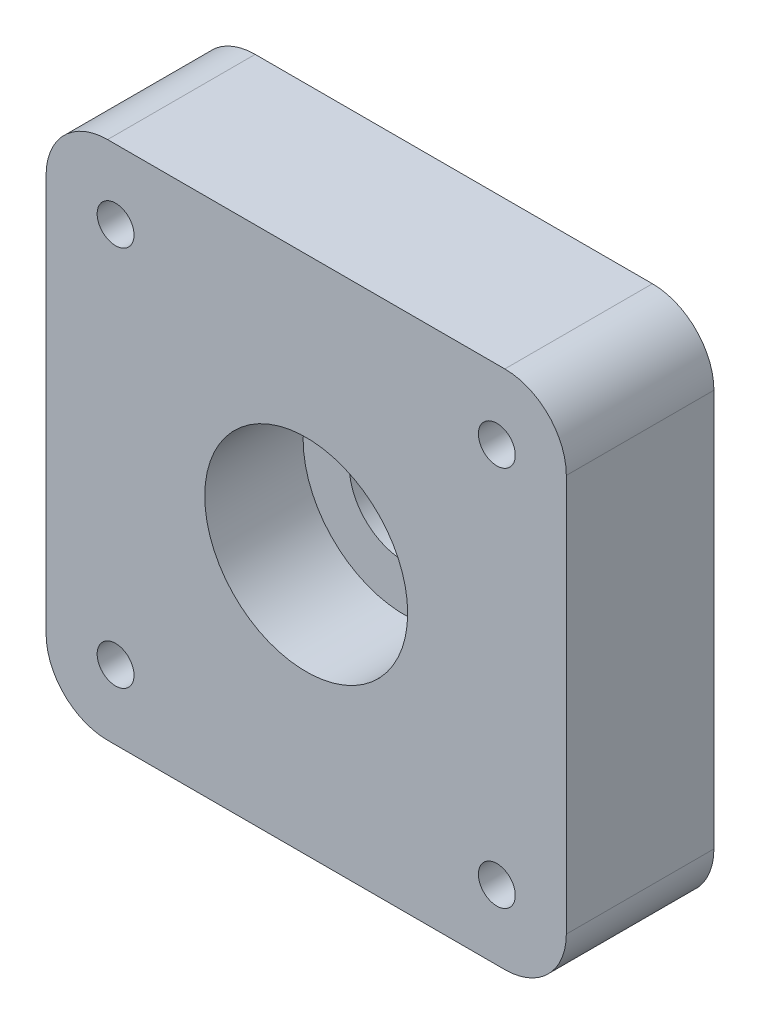
ISO-10303-21;
HEADER;
FILE_DESCRIPTION(('STEP AP214'),'2;1');
FILE_NAME('part.step','',(''),(''),'','','');
FILE_SCHEMA(('AUTOMOTIVE_DESIGN { 1 0 10303 214 1 1 1 1 }'));
ENDSEC;
DATA;
#1=APPLICATION_CONTEXT('core data for automotive mechanical design processes');
#2=APPLICATION_PROTOCOL_DEFINITION('international standard','automotive_design',2000,#1);
#3=PRODUCT_CONTEXT('',#1,'mechanical');
#4=PRODUCT('Part','Part','',(#3));
#5=PRODUCT_RELATED_PRODUCT_CATEGORY('part','',(#4));
#6=PRODUCT_DEFINITION_FORMATION('','',#4);
#7=PRODUCT_DEFINITION_CONTEXT('part definition',#1,'design');
#8=PRODUCT_DEFINITION('design','',#6,#7);
#9=PRODUCT_DEFINITION_SHAPE('','',#8);
#10=(LENGTH_UNIT() NAMED_UNIT(*) SI_UNIT(.MILLI.,.METRE.));
#11=(NAMED_UNIT(*) PLANE_ANGLE_UNIT() SI_UNIT($,.RADIAN.));
#12=(NAMED_UNIT(*) SI_UNIT($,.STERADIAN.) SOLID_ANGLE_UNIT());
#13=UNCERTAINTY_MEASURE_WITH_UNIT(LENGTH_MEASURE(1.E-05),#10,'distance_accuracy_value','');
#14=(GEOMETRIC_REPRESENTATION_CONTEXT(3) GLOBAL_UNCERTAINTY_ASSIGNED_CONTEXT((#13)) GLOBAL_UNIT_ASSIGNED_CONTEXT((#10,
#11,#12)) REPRESENTATION_CONTEXT('',''));
#15=CARTESIAN_POINT('',(0.,0.,0.));
#16=DIRECTION('',(0.,0.,1.));
#17=DIRECTION('',(1.,0.,0.));
#18=AXIS2_PLACEMENT_3D('',#15,#16,#17);
#19=CARTESIAN_POINT('',(0.,0.,6.));
#20=DIRECTION('',(0.,0.,-1.));
#21=DIRECTION('',(-1.,0.,0.));
#22=AXIS2_PLACEMENT_3D('',#19,#20,#21);
#23=PLANE('',#22);
#24=CARTESIAN_POINT('',(0.,0.,6.));
#25=DIRECTION('',(0.,0.,1.));
#26=DIRECTION('',(1.,0.,0.));
#27=AXIS2_PLACEMENT_3D('',#24,#25,#26);
#28=CIRCLE('',#27,8.25);
#29=CARTESIAN_POINT('',(8.25,0.,6.));
#30=VERTEX_POINT('',#29);
#31=EDGE_CURVE('E242',#30,#30,#28,.T.);
#32=ORIENTED_EDGE('',*,*,#31,.F.);
#33=EDGE_LOOP('',(#32));
#34=FACE_BOUND('',#33,.T.);
#35=DIRECTION('',(-1.,0.,0.));
#36=VECTOR('',#35,1.);
#37=CARTESIAN_POINT('',(-21.15,21.15,6.));
#38=LINE('',#37,#36);
#39=CARTESIAN_POINT('',(16.15,21.15,6.));
#40=VERTEX_POINT('',#39);
#41=CARTESIAN_POINT('',(-16.15,21.15,6.));
#42=VERTEX_POINT('',#41);
#43=EDGE_CURVE('E196',#40,#42,#38,.T.);
#44=ORIENTED_EDGE('',*,*,#43,.T.);
#45=CARTESIAN_POINT('',(-16.15,16.15,6.));
#46=DIRECTION('',(0.,0.,-1.));
#47=DIRECTION('',(-1.,0.,0.));
#48=AXIS2_PLACEMENT_3D('',#45,#46,#47);
#49=CIRCLE('',#48,5.);
#50=CARTESIAN_POINT('',(-21.15,16.15,6.));
#51=VERTEX_POINT('',#50);
#52=EDGE_CURVE('E171',#42,#51,#49,.F.);
#53=ORIENTED_EDGE('',*,*,#52,.T.);
#54=DIRECTION('',(0.,-1.,0.));
#55=VECTOR('',#54,1.);
#56=CARTESIAN_POINT('',(-21.15,-21.15,6.));
#57=LINE('',#56,#55);
#58=CARTESIAN_POINT('',(-21.15,-16.15,6.));
#59=VERTEX_POINT('',#58);
#60=EDGE_CURVE('E128',#51,#59,#57,.T.);
#61=ORIENTED_EDGE('',*,*,#60,.T.);
#62=CARTESIAN_POINT('',(-16.15,-16.15,6.));
#63=DIRECTION('',(0.,0.,-1.));
#64=DIRECTION('',(-1.,0.,0.));
#65=AXIS2_PLACEMENT_3D('',#62,#63,#64);
#66=CIRCLE('',#65,5.);
#67=CARTESIAN_POINT('',(-16.15,-21.15,6.));
#68=VERTEX_POINT('',#67);
#69=EDGE_CURVE('E63',#59,#68,#66,.F.);
#70=ORIENTED_EDGE('',*,*,#69,.T.);
#71=DIRECTION('',(1.,0.,0.));
#72=VECTOR('',#71,1.);
#73=CARTESIAN_POINT('',(-21.15,-21.15,6.));
#74=LINE('',#73,#72);
#75=CARTESIAN_POINT('',(16.15,-21.15,6.));
#76=VERTEX_POINT('',#75);
#77=EDGE_CURVE('E149',#68,#76,#74,.T.);
#78=ORIENTED_EDGE('',*,*,#77,.T.);
#79=CARTESIAN_POINT('',(16.15,-16.15,6.));
#80=DIRECTION('',(0.,0.,-1.));
#81=DIRECTION('',(-1.,0.,0.));
#82=AXIS2_PLACEMENT_3D('',#79,#80,#81);
#83=CIRCLE('',#82,5.);
#84=CARTESIAN_POINT('',(21.15,-16.15,6.));
#85=VERTEX_POINT('',#84);
#86=EDGE_CURVE('E166',#76,#85,#83,.F.);
#87=ORIENTED_EDGE('',*,*,#86,.T.);
#88=DIRECTION('',(0.,1.,0.));
#89=VECTOR('',#88,1.);
#90=CARTESIAN_POINT('',(21.15,-21.15,6.));
#91=LINE('',#90,#89);
#92=CARTESIAN_POINT('',(21.15,16.15,6.));
#93=VERTEX_POINT('',#92);
#94=EDGE_CURVE('E142',#85,#93,#91,.T.);
#95=ORIENTED_EDGE('',*,*,#94,.T.);
#96=CARTESIAN_POINT('',(16.15,16.15,6.));
#97=DIRECTION('',(0.,0.,-1.));
#98=DIRECTION('',(-1.,0.,0.));
#99=AXIS2_PLACEMENT_3D('',#96,#97,#98);
#100=CIRCLE('',#99,5.);
#101=EDGE_CURVE('E163',#93,#40,#100,.F.);
#102=ORIENTED_EDGE('',*,*,#101,.T.);
#103=EDGE_LOOP('',(#44,#53,#61,#70,#78,#87,#95,#102));
#104=FACE_BOUND('',#103,.T.);
#105=CARTESIAN_POINT('',(-15.5,15.5,6.));
#106=DIRECTION('',(0.,0.,1.));
#107=DIRECTION('',(1.,0.,0.));
#108=AXIS2_PLACEMENT_3D('',#105,#106,#107);
#109=CIRCLE('',#108,1.5);
#110=CARTESIAN_POINT('',(-14.,15.5,6.));
#111=VERTEX_POINT('',#110);
#112=EDGE_CURVE('E202',#111,#111,#109,.T.);
#113=ORIENTED_EDGE('',*,*,#112,.F.);
#114=EDGE_LOOP('',(#113));
#115=FACE_BOUND('',#114,.T.);
#116=CARTESIAN_POINT('',(-15.5,-15.5,6.));
#117=DIRECTION('',(0.,0.,1.));
#118=DIRECTION('',(1.,0.,0.));
#119=AXIS2_PLACEMENT_3D('',#116,#117,#118);
#120=CIRCLE('',#119,1.5);
#121=CARTESIAN_POINT('',(-14.,-15.5,6.));
#122=VERTEX_POINT('',#121);
#123=EDGE_CURVE('E216',#122,#122,#120,.T.);
#124=ORIENTED_EDGE('',*,*,#123,.F.);
#125=EDGE_LOOP('',(#124));
#126=FACE_BOUND('',#125,.T.);
#127=CARTESIAN_POINT('',(15.5,-15.5,6.));
#128=DIRECTION('',(0.,0.,1.));
#129=DIRECTION('',(-1.,0.,0.));
#130=AXIS2_PLACEMENT_3D('',#127,#128,#129);
#131=CIRCLE('',#130,1.5);
#132=CARTESIAN_POINT('',(14.,-15.5,6.));
#133=VERTEX_POINT('',#132);
#134=EDGE_CURVE('E222',#133,#133,#131,.T.);
#135=ORIENTED_EDGE('',*,*,#134,.F.);
#136=EDGE_LOOP('',(#135));
#137=FACE_BOUND('',#136,.T.);
#138=CARTESIAN_POINT('',(15.5,15.5,6.));
#139=DIRECTION('',(0.,0.,1.));
#140=DIRECTION('',(-1.,0.,0.));
#141=AXIS2_PLACEMENT_3D('',#138,#139,#140);
#142=CIRCLE('',#141,1.5);
#143=CARTESIAN_POINT('',(14.,15.5,6.));
#144=VERTEX_POINT('',#143);
#145=EDGE_CURVE('E230',#144,#144,#142,.T.);
#146=ORIENTED_EDGE('',*,*,#145,.F.);
#147=EDGE_LOOP('',(#146));
#148=FACE_BOUND('',#147,.T.);
#149=ADVANCED_FACE('F39',(#34,#104,#115,#126,#137,#148),#23,.F.);
#150=CARTESIAN_POINT('',(0.,0.,-6.));
#151=DIRECTION('',(0.,0.,-1.));
#152=DIRECTION('',(-1.,0.,0.));
#153=AXIS2_PLACEMENT_3D('',#150,#151,#152);
#154=PLANE('',#153);
#155=CARTESIAN_POINT('',(0.,0.,-6.));
#156=DIRECTION('',(0.,0.,-1.));
#157=DIRECTION('',(-1.,0.,0.));
#158=AXIS2_PLACEMENT_3D('',#155,#156,#157);
#159=CIRCLE('',#158,4.5);
#160=CARTESIAN_POINT('',(-4.5,0.,-6.));
#161=VERTEX_POINT('',#160);
#162=EDGE_CURVE('E249',#161,#161,#159,.T.);
#163=ORIENTED_EDGE('',*,*,#162,.F.);
#164=EDGE_LOOP('',(#163));
#165=FACE_BOUND('',#164,.T.);
#166=CARTESIAN_POINT('',(15.5,-15.5,-6.));
#167=DIRECTION('',(0.,0.,1.));
#168=DIRECTION('',(-1.,0.,0.));
#169=AXIS2_PLACEMENT_3D('',#166,#167,#168);
#170=CIRCLE('',#169,1.5);
#171=CARTESIAN_POINT('',(14.,-15.5,-6.));
#172=VERTEX_POINT('',#171);
#173=EDGE_CURVE('E226',#172,#172,#170,.T.);
#174=ORIENTED_EDGE('',*,*,#173,.T.);
#175=EDGE_LOOP('',(#174));
#176=FACE_BOUND('',#175,.T.);
#177=CARTESIAN_POINT('',(-15.5,15.5,-6.));
#178=DIRECTION('',(0.,0.,1.));
#179=DIRECTION('',(1.,0.,0.));
#180=AXIS2_PLACEMENT_3D('',#177,#178,#179);
#181=CIRCLE('',#180,1.5);
#182=CARTESIAN_POINT('',(-14.,15.5,-6.));
#183=VERTEX_POINT('',#182);
#184=EDGE_CURVE('E205',#183,#183,#181,.T.);
#185=ORIENTED_EDGE('',*,*,#184,.T.);
#186=EDGE_LOOP('',(#185));
#187=FACE_BOUND('',#186,.T.);
#188=DIRECTION('',(0.,-1.,0.));
#189=VECTOR('',#188,1.);
#190=CARTESIAN_POINT('',(-21.15,-21.15,-6.));
#191=LINE('',#190,#189);
#192=CARTESIAN_POINT('',(-21.15,16.15,-6.));
#193=VERTEX_POINT('',#192);
#194=CARTESIAN_POINT('',(-21.15,-16.15,-6.));
#195=VERTEX_POINT('',#194);
#196=EDGE_CURVE('E126',#193,#195,#191,.T.);
#197=ORIENTED_EDGE('',*,*,#196,.F.);
#198=CARTESIAN_POINT('',(-16.15,16.15,-6.));
#199=DIRECTION('',(0.,0.,-1.));
#200=DIRECTION('',(-1.,0.,0.));
#201=AXIS2_PLACEMENT_3D('',#198,#199,#200);
#202=CIRCLE('',#201,5.);
#203=CARTESIAN_POINT('',(-16.15,21.15,-6.));
#204=VERTEX_POINT('',#203);
#205=EDGE_CURVE('E108',#193,#204,#202,.T.);
#206=ORIENTED_EDGE('',*,*,#205,.T.);
#207=DIRECTION('',(-1.,0.,0.));
#208=VECTOR('',#207,1.);
#209=CARTESIAN_POINT('',(-21.15,21.15,-6.));
#210=LINE('',#209,#208);
#211=CARTESIAN_POINT('',(16.15,21.15,-6.));
#212=VERTEX_POINT('',#211);
#213=EDGE_CURVE('E138',#212,#204,#210,.T.);
#214=ORIENTED_EDGE('',*,*,#213,.F.);
#215=CARTESIAN_POINT('',(16.15,16.15,-6.));
#216=DIRECTION('',(0.,0.,-1.));
#217=DIRECTION('',(-1.,0.,0.));
#218=AXIS2_PLACEMENT_3D('',#215,#216,#217);
#219=CIRCLE('',#218,5.);
#220=CARTESIAN_POINT('',(21.15,16.15,-6.));
#221=VERTEX_POINT('',#220);
#222=EDGE_CURVE('E130',#212,#221,#219,.T.);
#223=ORIENTED_EDGE('',*,*,#222,.T.);
#224=DIRECTION('',(0.,1.,0.));
#225=VECTOR('',#224,1.);
#226=CARTESIAN_POINT('',(21.15,-21.15,-6.));
#227=LINE('',#226,#225);
#228=CARTESIAN_POINT('',(21.15,-16.15,-6.));
#229=VERTEX_POINT('',#228);
#230=EDGE_CURVE('E144',#229,#221,#227,.T.);
#231=ORIENTED_EDGE('',*,*,#230,.F.);
#232=CARTESIAN_POINT('',(16.15,-16.15,-6.));
#233=DIRECTION('',(0.,0.,-1.));
#234=DIRECTION('',(-1.,0.,0.));
#235=AXIS2_PLACEMENT_3D('',#232,#233,#234);
#236=CIRCLE('',#235,5.);
#237=CARTESIAN_POINT('',(16.15,-21.15,-6.));
#238=VERTEX_POINT('',#237);
#239=EDGE_CURVE('E153',#229,#238,#236,.T.);
#240=ORIENTED_EDGE('',*,*,#239,.T.);
#241=DIRECTION('',(1.,0.,0.));
#242=VECTOR('',#241,1.);
#243=CARTESIAN_POINT('',(-21.15,-21.15,-6.));
#244=LINE('',#243,#242);
#245=CARTESIAN_POINT('',(-16.15,-21.15,-6.));
#246=VERTEX_POINT('',#245);
#247=EDGE_CURVE('E137',#246,#238,#244,.T.);
#248=ORIENTED_EDGE('',*,*,#247,.F.);
#249=CARTESIAN_POINT('',(-16.15,-16.15,-6.));
#250=DIRECTION('',(0.,0.,-1.));
#251=DIRECTION('',(-1.,0.,0.));
#252=AXIS2_PLACEMENT_3D('',#249,#250,#251);
#253=CIRCLE('',#252,5.);
#254=EDGE_CURVE('E120',#246,#195,#253,.T.);
#255=ORIENTED_EDGE('',*,*,#254,.T.);
#256=EDGE_LOOP('',(#197,#206,#214,#223,#231,#240,#248,#255));
#257=FACE_BOUND('',#256,.T.);
#258=CARTESIAN_POINT('',(-15.5,-15.5,-6.));
#259=DIRECTION('',(0.,0.,1.));
#260=DIRECTION('',(1.,0.,0.));
#261=AXIS2_PLACEMENT_3D('',#258,#259,#260);
#262=CIRCLE('',#261,1.5);
#263=CARTESIAN_POINT('',(-14.,-15.5,-6.));
#264=VERTEX_POINT('',#263);
#265=EDGE_CURVE('E218',#264,#264,#262,.T.);
#266=ORIENTED_EDGE('',*,*,#265,.T.);
#267=EDGE_LOOP('',(#266));
#268=FACE_BOUND('',#267,.T.);
#269=CARTESIAN_POINT('',(15.5,15.5,-6.));
#270=DIRECTION('',(0.,0.,1.));
#271=DIRECTION('',(-1.,0.,0.));
#272=AXIS2_PLACEMENT_3D('',#269,#270,#271);
#273=CIRCLE('',#272,1.5);
#274=CARTESIAN_POINT('',(14.,15.5,-6.));
#275=VERTEX_POINT('',#274);
#276=EDGE_CURVE('E234',#275,#275,#273,.T.);
#277=ORIENTED_EDGE('',*,*,#276,.T.);
#278=EDGE_LOOP('',(#277));
#279=FACE_BOUND('',#278,.T.);
#280=ADVANCED_FACE('F133',(#165,#176,#187,#257,#268,#279),#154,.T.);
#281=CARTESIAN_POINT('',(21.15,-21.15,6.));
#282=DIRECTION('',(-1.,0.,0.));
#283=DIRECTION('',(0.,0.,1.));
#284=AXIS2_PLACEMENT_3D('',#281,#282,#283);
#285=PLANE('',#284);
#286=ORIENTED_EDGE('',*,*,#94,.F.);
#287=DIRECTION('',(0.,0.,-1.));
#288=VECTOR('',#287,1.);
#289=CARTESIAN_POINT('',(21.15,-16.15,6.));
#290=LINE('',#289,#288);
#291=EDGE_CURVE('E11',#85,#229,#290,.T.);
#292=ORIENTED_EDGE('',*,*,#291,.T.);
#293=ORIENTED_EDGE('',*,*,#230,.T.);
#294=DIRECTION('',(0.,0.,-1.));
#295=VECTOR('',#294,1.);
#296=CARTESIAN_POINT('',(21.15,16.15,6.));
#297=LINE('',#296,#295);
#298=EDGE_CURVE('E49',#221,#93,#297,.F.);
#299=ORIENTED_EDGE('',*,*,#298,.T.);
#300=EDGE_LOOP('',(#286,#292,#293,#299));
#301=FACE_BOUND('',#300,.T.);
#302=ADVANCED_FACE('F186',(#301),#285,.F.);
#303=CARTESIAN_POINT('',(-21.15,21.15,6.));
#304=DIRECTION('',(0.,-1.,0.));
#305=DIRECTION('',(0.,0.,-1.));
#306=AXIS2_PLACEMENT_3D('',#303,#304,#305);
#307=PLANE('',#306);
#308=ORIENTED_EDGE('',*,*,#213,.T.);
#309=DIRECTION('',(0.,0.,-1.));
#310=VECTOR('',#309,1.);
#311=CARTESIAN_POINT('',(-16.15,21.15,6.));
#312=LINE('',#311,#310);
#313=EDGE_CURVE('E113',#204,#42,#312,.F.);
#314=ORIENTED_EDGE('',*,*,#313,.T.);
#315=ORIENTED_EDGE('',*,*,#43,.F.);
#316=DIRECTION('',(0.,0.,-1.));
#317=VECTOR('',#316,1.);
#318=CARTESIAN_POINT('',(16.15,21.15,6.));
#319=LINE('',#318,#317);
#320=EDGE_CURVE('E119',#40,#212,#319,.T.);
#321=ORIENTED_EDGE('',*,*,#320,.T.);
#322=EDGE_LOOP('',(#308,#314,#315,#321));
#323=FACE_BOUND('',#322,.T.);
#324=ADVANCED_FACE('F200',(#323),#307,.F.);
#325=CARTESIAN_POINT('',(-21.15,-21.15,6.));
#326=DIRECTION('',(1.,0.,0.));
#327=DIRECTION('',(0.,0.,-1.));
#328=AXIS2_PLACEMENT_3D('',#325,#326,#327);
#329=PLANE('',#328);
#330=ORIENTED_EDGE('',*,*,#60,.F.);
#331=DIRECTION('',(0.,0.,-1.));
#332=VECTOR('',#331,1.);
#333=CARTESIAN_POINT('',(-21.15,16.15,6.));
#334=LINE('',#333,#332);
#335=EDGE_CURVE('E112',#51,#193,#334,.T.);
#336=ORIENTED_EDGE('',*,*,#335,.T.);
#337=ORIENTED_EDGE('',*,*,#196,.T.);
#338=DIRECTION('',(0.,0.,-1.));
#339=VECTOR('',#338,1.);
#340=CARTESIAN_POINT('',(-21.15,-16.15,6.));
#341=LINE('',#340,#339);
#342=EDGE_CURVE('E131',#195,#59,#341,.F.);
#343=ORIENTED_EDGE('',*,*,#342,.T.);
#344=EDGE_LOOP('',(#330,#336,#337,#343));
#345=FACE_BOUND('',#344,.T.);
#346=ADVANCED_FACE('F125',(#345),#329,.F.);
#347=CARTESIAN_POINT('',(-21.15,-21.15,6.));
#348=DIRECTION('',(0.,1.,0.));
#349=DIRECTION('',(0.,0.,1.));
#350=AXIS2_PLACEMENT_3D('',#347,#348,#349);
#351=PLANE('',#350);
#352=ORIENTED_EDGE('',*,*,#77,.F.);
#353=DIRECTION('',(0.,0.,-1.));
#354=VECTOR('',#353,1.);
#355=CARTESIAN_POINT('',(-16.15,-21.15,6.));
#356=LINE('',#355,#354);
#357=EDGE_CURVE('E176',#68,#246,#356,.T.);
#358=ORIENTED_EDGE('',*,*,#357,.T.);
#359=ORIENTED_EDGE('',*,*,#247,.T.);
#360=DIRECTION('',(0.,0.,-1.));
#361=VECTOR('',#360,1.);
#362=CARTESIAN_POINT('',(16.15,-21.15,6.));
#363=LINE('',#362,#361);
#364=EDGE_CURVE('E56',#238,#76,#363,.F.);
#365=ORIENTED_EDGE('',*,*,#364,.T.);
#366=EDGE_LOOP('',(#352,#358,#359,#365));
#367=FACE_BOUND('',#366,.T.);
#368=ADVANCED_FACE('F283',(#367),#351,.F.);
#369=CARTESIAN_POINT('',(-15.5,15.5,6.));
#370=DIRECTION('',(0.,0.,-1.));
#371=DIRECTION('',(-1.,0.,0.));
#372=AXIS2_PLACEMENT_3D('',#369,#370,#371);
#373=CYLINDRICAL_SURFACE('',#372,1.5);
#374=ORIENTED_EDGE('',*,*,#112,.T.);
#375=EDGE_LOOP('',(#374));
#376=FACE_BOUND('',#375,.T.);
#377=ORIENTED_EDGE('',*,*,#184,.F.);
#378=EDGE_LOOP('',(#377));
#379=FACE_BOUND('',#378,.T.);
#380=ADVANCED_FACE('F280',(#376,#379),#373,.F.);
#381=CARTESIAN_POINT('',(-15.5,-15.5,6.));
#382=DIRECTION('',(0.,0.,-1.));
#383=DIRECTION('',(-1.,0.,0.));
#384=AXIS2_PLACEMENT_3D('',#381,#382,#383);
#385=CYLINDRICAL_SURFACE('',#384,1.5);
#386=ORIENTED_EDGE('',*,*,#123,.T.);
#387=EDGE_LOOP('',(#386));
#388=FACE_BOUND('',#387,.T.);
#389=ORIENTED_EDGE('',*,*,#265,.F.);
#390=EDGE_LOOP('',(#389));
#391=FACE_BOUND('',#390,.T.);
#392=ADVANCED_FACE('F362',(#388,#391),#385,.F.);
#393=CARTESIAN_POINT('',(15.5,-15.5,6.));
#394=DIRECTION('',(0.,0.,-1.));
#395=DIRECTION('',(-1.,0.,0.));
#396=AXIS2_PLACEMENT_3D('',#393,#394,#395);
#397=CYLINDRICAL_SURFACE('',#396,1.5);
#398=ORIENTED_EDGE('',*,*,#134,.T.);
#399=EDGE_LOOP('',(#398));
#400=FACE_BOUND('',#399,.T.);
#401=ORIENTED_EDGE('',*,*,#173,.F.);
#402=EDGE_LOOP('',(#401));
#403=FACE_BOUND('',#402,.T.);
#404=ADVANCED_FACE('F352',(#400,#403),#397,.F.);
#405=CARTESIAN_POINT('',(15.5,15.5,6.));
#406=DIRECTION('',(0.,0.,-1.));
#407=DIRECTION('',(-1.,0.,0.));
#408=AXIS2_PLACEMENT_3D('',#405,#406,#407);
#409=CYLINDRICAL_SURFACE('',#408,1.5);
#410=ORIENTED_EDGE('',*,*,#145,.T.);
#411=EDGE_LOOP('',(#410));
#412=FACE_BOUND('',#411,.T.);
#413=ORIENTED_EDGE('',*,*,#276,.F.);
#414=EDGE_LOOP('',(#413));
#415=FACE_BOUND('',#414,.T.);
#416=ADVANCED_FACE('F295',(#412,#415),#409,.F.);
#417=CARTESIAN_POINT('',(-16.15,16.15,6.));
#418=DIRECTION('',(0.,0.,-1.));
#419=DIRECTION('',(-1.,0.,0.));
#420=AXIS2_PLACEMENT_3D('',#417,#418,#419);
#421=CYLINDRICAL_SURFACE('',#420,5.);
#422=ORIENTED_EDGE('',*,*,#52,.F.);
#423=ORIENTED_EDGE('',*,*,#313,.F.);
#424=ORIENTED_EDGE('',*,*,#205,.F.);
#425=ORIENTED_EDGE('',*,*,#335,.F.);
#426=EDGE_LOOP('',(#422,#423,#424,#425));
#427=FACE_BOUND('',#426,.T.);
#428=ADVANCED_FACE('F111',(#427),#421,.T.);
#429=CARTESIAN_POINT('',(-16.15,-16.15,6.));
#430=DIRECTION('',(0.,0.,-1.));
#431=DIRECTION('',(-1.,0.,0.));
#432=AXIS2_PLACEMENT_3D('',#429,#430,#431);
#433=CYLINDRICAL_SURFACE('',#432,5.);
#434=ORIENTED_EDGE('',*,*,#69,.F.);
#435=ORIENTED_EDGE('',*,*,#342,.F.);
#436=ORIENTED_EDGE('',*,*,#254,.F.);
#437=ORIENTED_EDGE('',*,*,#357,.F.);
#438=EDGE_LOOP('',(#434,#435,#436,#437));
#439=FACE_BOUND('',#438,.T.);
#440=ADVANCED_FACE('F294',(#439),#433,.T.);
#441=CARTESIAN_POINT('',(16.15,-16.15,6.));
#442=DIRECTION('',(0.,0.,-1.));
#443=DIRECTION('',(-1.,0.,0.));
#444=AXIS2_PLACEMENT_3D('',#441,#442,#443);
#445=CYLINDRICAL_SURFACE('',#444,5.);
#446=ORIENTED_EDGE('',*,*,#86,.F.);
#447=ORIENTED_EDGE('',*,*,#364,.F.);
#448=ORIENTED_EDGE('',*,*,#239,.F.);
#449=ORIENTED_EDGE('',*,*,#291,.F.);
#450=EDGE_LOOP('',(#446,#447,#448,#449));
#451=FACE_BOUND('',#450,.T.);
#452=ADVANCED_FACE('F297',(#451),#445,.T.);
#453=CARTESIAN_POINT('',(16.15,16.15,6.));
#454=DIRECTION('',(0.,0.,-1.));
#455=DIRECTION('',(-1.,0.,0.));
#456=AXIS2_PLACEMENT_3D('',#453,#454,#455);
#457=CYLINDRICAL_SURFACE('',#456,5.);
#458=ORIENTED_EDGE('',*,*,#101,.F.);
#459=ORIENTED_EDGE('',*,*,#298,.F.);
#460=ORIENTED_EDGE('',*,*,#222,.F.);
#461=ORIENTED_EDGE('',*,*,#320,.F.);
#462=EDGE_LOOP('',(#458,#459,#460,#461));
#463=FACE_BOUND('',#462,.T.);
#464=ADVANCED_FACE('F41',(#463),#457,.T.);
#465=CARTESIAN_POINT('',(0.,0.,-2.));
#466=DIRECTION('',(0.,0.,1.));
#467=DIRECTION('',(1.,0.,0.));
#468=AXIS2_PLACEMENT_3D('',#465,#466,#467);
#469=CYLINDRICAL_SURFACE('',#468,8.25);
#470=CARTESIAN_POINT('',(0.,0.,-2.));
#471=DIRECTION('',(0.,0.,1.));
#472=DIRECTION('',(1.,0.,0.));
#473=AXIS2_PLACEMENT_3D('',#470,#471,#472);
#474=CIRCLE('',#473,8.25);
#475=CARTESIAN_POINT('',(8.25,0.,-2.));
#476=VERTEX_POINT('',#475);
#477=EDGE_CURVE('E238',#476,#476,#474,.T.);
#478=ORIENTED_EDGE('',*,*,#477,.F.);
#479=EDGE_LOOP('',(#478));
#480=FACE_BOUND('',#479,.T.);
#481=ORIENTED_EDGE('',*,*,#31,.T.);
#482=EDGE_LOOP('',(#481));
#483=FACE_BOUND('',#482,.T.);
#484=ADVANCED_FACE('F263',(#480,#483),#469,.F.);
#485=CARTESIAN_POINT('',(0.,0.,-2.));
#486=DIRECTION('',(0.,0.,1.));
#487=DIRECTION('',(1.,0.,0.));
#488=AXIS2_PLACEMENT_3D('',#485,#486,#487);
#489=PLANE('',#488);
#490=CARTESIAN_POINT('',(0.,0.,-2.));
#491=DIRECTION('',(0.,0.,1.));
#492=DIRECTION('',(1.,0.,0.));
#493=AXIS2_PLACEMENT_3D('',#490,#491,#492);
#494=CIRCLE('',#493,4.5);
#495=CARTESIAN_POINT('',(4.5,0.,-2.));
#496=VERTEX_POINT('',#495);
#497=EDGE_CURVE('E43',#496,#496,#494,.T.);
#498=ORIENTED_EDGE('',*,*,#497,.F.);
#499=EDGE_LOOP('',(#498));
#500=FACE_BOUND('',#499,.T.);
#501=ORIENTED_EDGE('',*,*,#477,.T.);
#502=EDGE_LOOP('',(#501));
#503=FACE_BOUND('',#502,.T.);
#504=ADVANCED_FACE('F260',(#500,#503),#489,.T.);
#505=CARTESIAN_POINT('',(0.,0.,4.));
#506=DIRECTION('',(0.,0.,-1.));
#507=DIRECTION('',(-1.,0.,0.));
#508=AXIS2_PLACEMENT_3D('',#505,#506,#507);
#509=CYLINDRICAL_SURFACE('',#508,4.5);
#510=ORIENTED_EDGE('',*,*,#497,.T.);
#511=EDGE_LOOP('',(#510));
#512=FACE_BOUND('',#511,.T.);
#513=ORIENTED_EDGE('',*,*,#162,.T.);
#514=EDGE_LOOP('',(#513));
#515=FACE_BOUND('',#514,.T.);
#516=ADVANCED_FACE('F258',(#512,#515),#509,.F.);
#517=CLOSED_SHELL('',(#149,#280,#302,#324,#346,#368,#380,#392,#404,#416,#428,#440,#452,#464,
#484,#504,#516));
#518=MANIFOLD_SOLID_BREP('B2',#517);
#519=ADVANCED_BREP_SHAPE_REPRESENTATION('',(#18,#518),#14);
#520=SHAPE_DEFINITION_REPRESENTATION(#9,#519);
ENDSEC;
END-ISO-10303-21;
